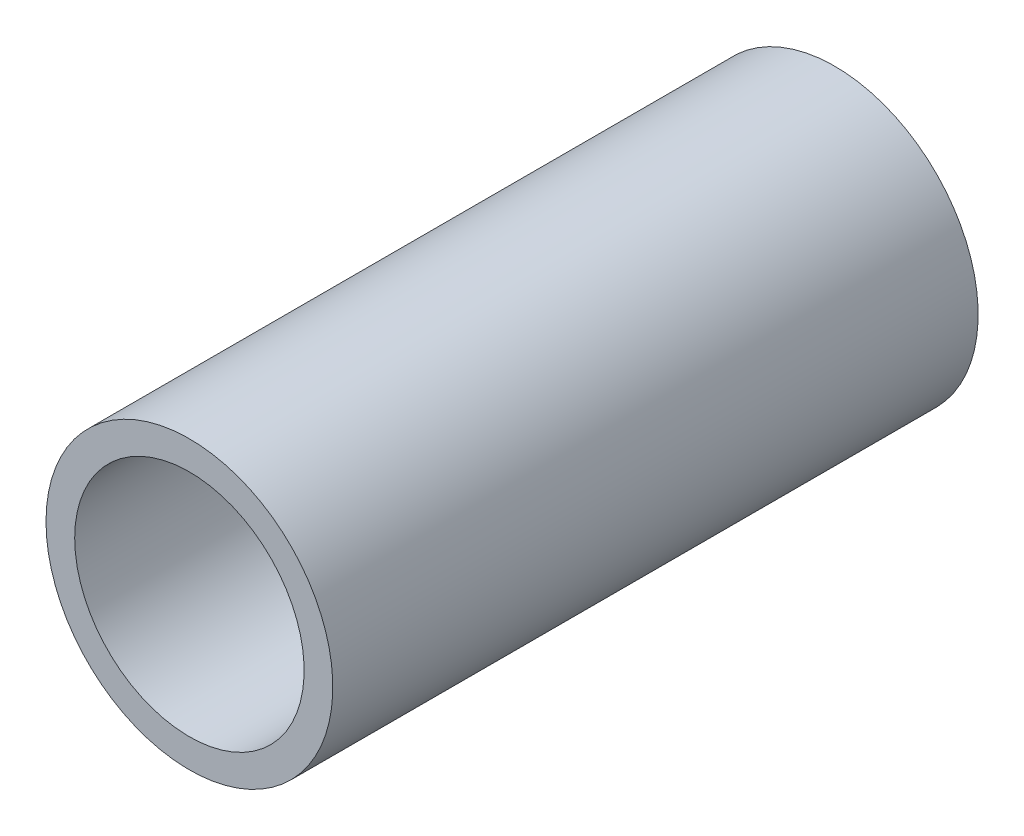
ISO-10303-21;
HEADER;
FILE_DESCRIPTION(('STEP AP214'),'2;1');
FILE_NAME('part.step','',(''),(''),'','','');
FILE_SCHEMA(('AUTOMOTIVE_DESIGN { 1 0 10303 214 1 1 1 1 }'));
ENDSEC;
DATA;
#1=APPLICATION_CONTEXT('core data for automotive mechanical design processes');
#2=APPLICATION_PROTOCOL_DEFINITION('international standard','automotive_design',2000,#1);
#3=PRODUCT_CONTEXT('',#1,'mechanical');
#4=PRODUCT('Part','Part','',(#3));
#5=PRODUCT_RELATED_PRODUCT_CATEGORY('part','',(#4));
#6=PRODUCT_DEFINITION_FORMATION('','',#4);
#7=PRODUCT_DEFINITION_CONTEXT('part definition',#1,'design');
#8=PRODUCT_DEFINITION('design','',#6,#7);
#9=PRODUCT_DEFINITION_SHAPE('','',#8);
#10=(LENGTH_UNIT() NAMED_UNIT(*) SI_UNIT(.MILLI.,.METRE.));
#11=(NAMED_UNIT(*) PLANE_ANGLE_UNIT() SI_UNIT($,.RADIAN.));
#12=(NAMED_UNIT(*) SI_UNIT($,.STERADIAN.) SOLID_ANGLE_UNIT());
#13=UNCERTAINTY_MEASURE_WITH_UNIT(LENGTH_MEASURE(1.E-05),#10,'distance_accuracy_value','');
#14=(GEOMETRIC_REPRESENTATION_CONTEXT(3) GLOBAL_UNCERTAINTY_ASSIGNED_CONTEXT((#13)) GLOBAL_UNIT_ASSIGNED_CONTEXT((#10,
#11,#12)) REPRESENTATION_CONTEXT('',''));
#15=CARTESIAN_POINT('',(0.,0.,0.));
#16=DIRECTION('',(0.,0.,1.));
#17=DIRECTION('',(1.,0.,0.));
#18=AXIS2_PLACEMENT_3D('',#15,#16,#17);
#19=CARTESIAN_POINT('',(0.,0.,45.));
#20=DIRECTION('',(0.,0.,1.));
#21=DIRECTION('',(1.,0.,0.));
#22=AXIS2_PLACEMENT_3D('',#19,#20,#21);
#23=PLANE('',#22);
#24=CARTESIAN_POINT('',(0.,0.,45.));
#25=DIRECTION('',(0.,0.,1.));
#26=DIRECTION('',(1.,0.,0.));
#27=AXIS2_PLACEMENT_3D('',#24,#25,#26);
#28=CIRCLE('',#27,10.);
#29=CARTESIAN_POINT('',(-10.,0.,45.));
#30=VERTEX_POINT('',#29);
#31=EDGE_CURVE('E10',#30,#30,#28,.T.);
#32=ORIENTED_EDGE('',*,*,#31,.T.);
#33=EDGE_LOOP('',(#32));
#34=FACE_BOUND('',#33,.T.);
#35=CARTESIAN_POINT('',(0.,0.,45.));
#36=DIRECTION('',(0.,0.,1.));
#37=DIRECTION('',(1.,0.,0.));
#38=AXIS2_PLACEMENT_3D('',#35,#36,#37);
#39=CIRCLE('',#38,8.);
#40=CARTESIAN_POINT('',(-8.,0.,45.));
#41=VERTEX_POINT('',#40);
#42=EDGE_CURVE('E41',#41,#41,#39,.T.);
#43=ORIENTED_EDGE('',*,*,#42,.F.);
#44=EDGE_LOOP('',(#43));
#45=FACE_BOUND('',#44,.T.);
#46=ADVANCED_FACE('F30',(#34,#45),#23,.T.);
#47=CARTESIAN_POINT('',(0.,0.,0.));
#48=DIRECTION('',(0.,0.,1.));
#49=DIRECTION('',(1.,0.,0.));
#50=AXIS2_PLACEMENT_3D('',#47,#48,#49);
#51=PLANE('',#50);
#52=CARTESIAN_POINT('',(0.,0.,0.));
#53=DIRECTION('',(0.,0.,1.));
#54=DIRECTION('',(1.,0.,0.));
#55=AXIS2_PLACEMENT_3D('',#52,#53,#54);
#56=CIRCLE('',#55,10.);
#57=CARTESIAN_POINT('',(-10.,0.,0.));
#58=VERTEX_POINT('',#57);
#59=EDGE_CURVE('E34',#58,#58,#56,.T.);
#60=ORIENTED_EDGE('',*,*,#59,.F.);
#61=EDGE_LOOP('',(#60));
#62=FACE_BOUND('',#61,.T.);
#63=CARTESIAN_POINT('',(0.,0.,0.));
#64=DIRECTION('',(0.,0.,1.));
#65=DIRECTION('',(1.,0.,0.));
#66=AXIS2_PLACEMENT_3D('',#63,#64,#65);
#67=CIRCLE('',#66,8.);
#68=CARTESIAN_POINT('',(-8.,0.,0.));
#69=VERTEX_POINT('',#68);
#70=EDGE_CURVE('E43',#69,#69,#67,.T.);
#71=ORIENTED_EDGE('',*,*,#70,.T.);
#72=EDGE_LOOP('',(#71));
#73=FACE_BOUND('',#72,.T.);
#74=ADVANCED_FACE('F53',(#62,#73),#51,.F.);
#75=CARTESIAN_POINT('',(0.,0.,45.));
#76=DIRECTION('',(0.,0.,-1.));
#77=DIRECTION('',(-1.,0.,0.));
#78=AXIS2_PLACEMENT_3D('',#75,#76,#77);
#79=CYLINDRICAL_SURFACE('',#78,10.);
#80=CARTESIAN_POINT('',(-10.,0.,45.));
#81=CARTESIAN_POINT('',(-10.,0.,44.53125));
#82=CARTESIAN_POINT('',(-10.,0.,44.0625));
#83=CARTESIAN_POINT('',(-10.,0.,43.125));
#84=CARTESIAN_POINT('',(-10.,0.,42.65625));
#85=CARTESIAN_POINT('',(-10.,0.,41.71875));
#86=CARTESIAN_POINT('',(-10.,0.,41.25));
#87=CARTESIAN_POINT('',(-10.,0.,40.3125));
#88=CARTESIAN_POINT('',(-10.,0.,39.84375));
#89=CARTESIAN_POINT('',(-10.,0.,38.90625));
#90=CARTESIAN_POINT('',(-10.,0.,38.4375));
#91=CARTESIAN_POINT('',(-10.,0.,37.5));
#92=CARTESIAN_POINT('',(-10.,0.,37.03125));
#93=CARTESIAN_POINT('',(-10.,0.,36.09375));
#94=CARTESIAN_POINT('',(-10.,0.,35.625));
#95=CARTESIAN_POINT('',(-10.,0.,34.6875));
#96=CARTESIAN_POINT('',(-10.,0.,34.21875));
#97=CARTESIAN_POINT('',(-10.,0.,33.28125));
#98=CARTESIAN_POINT('',(-10.,0.,32.8125));
#99=CARTESIAN_POINT('',(-10.,0.,31.875));
#100=CARTESIAN_POINT('',(-10.,0.,31.40625));
#101=CARTESIAN_POINT('',(-10.,0.,30.46875));
#102=CARTESIAN_POINT('',(-10.,0.,30.));
#103=CARTESIAN_POINT('',(-10.,0.,29.0625));
#104=CARTESIAN_POINT('',(-10.,0.,28.59375));
#105=CARTESIAN_POINT('',(-10.,0.,27.65625));
#106=CARTESIAN_POINT('',(-10.,0.,27.1875));
#107=CARTESIAN_POINT('',(-10.,0.,26.25));
#108=CARTESIAN_POINT('',(-10.,0.,25.78125));
#109=CARTESIAN_POINT('',(-10.,0.,24.84375));
#110=CARTESIAN_POINT('',(-10.,0.,24.375));
#111=CARTESIAN_POINT('',(-10.,0.,23.4375));
#112=CARTESIAN_POINT('',(-10.,0.,22.96875));
#113=CARTESIAN_POINT('',(-10.,0.,22.03125));
#114=CARTESIAN_POINT('',(-10.,0.,21.5625));
#115=CARTESIAN_POINT('',(-10.,0.,20.625));
#116=CARTESIAN_POINT('',(-10.,0.,20.15625));
#117=CARTESIAN_POINT('',(-10.,0.,19.21875));
#118=CARTESIAN_POINT('',(-10.,0.,18.75));
#119=CARTESIAN_POINT('',(-10.,0.,17.8125));
#120=CARTESIAN_POINT('',(-10.,0.,17.34375));
#121=CARTESIAN_POINT('',(-10.,0.,16.40625));
#122=CARTESIAN_POINT('',(-10.,0.,15.9375));
#123=CARTESIAN_POINT('',(-10.,0.,15.));
#124=CARTESIAN_POINT('',(-10.,0.,14.53125));
#125=CARTESIAN_POINT('',(-10.,0.,13.59375));
#126=CARTESIAN_POINT('',(-10.,0.,13.125));
#127=CARTESIAN_POINT('',(-10.,0.,12.1875));
#128=CARTESIAN_POINT('',(-10.,0.,11.71875));
#129=CARTESIAN_POINT('',(-10.,0.,10.78125));
#130=CARTESIAN_POINT('',(-10.,0.,10.3125));
#131=CARTESIAN_POINT('',(-10.,0.,9.375));
#132=CARTESIAN_POINT('',(-10.,0.,8.90625));
#133=CARTESIAN_POINT('',(-10.,0.,7.96874999999999));
#134=CARTESIAN_POINT('',(-10.,0.,7.5));
#135=CARTESIAN_POINT('',(-10.,0.,6.5625));
#136=CARTESIAN_POINT('',(-10.,0.,6.09375));
#137=CARTESIAN_POINT('',(-10.,0.,5.15625));
#138=CARTESIAN_POINT('',(-10.,0.,4.68749999999999));
#139=CARTESIAN_POINT('',(-10.,0.,3.74999999999999));
#140=CARTESIAN_POINT('',(-10.,0.,3.28124999999999));
#141=CARTESIAN_POINT('',(-10.,0.,2.34374999999999));
#142=CARTESIAN_POINT('',(-10.,0.,1.87499999999999));
#143=CARTESIAN_POINT('',(-10.,0.,0.937499999999992));
#144=CARTESIAN_POINT('',(-10.,0.,0.468749999999993));
#145=CARTESIAN_POINT('',(-10.,0.,0.));
#146=B_SPLINE_CURVE_WITH_KNOTS('',3,(#80,#81,#82,#83,#84,#85,#86,#87,#88,#89,#90,#91,#92,#93,
#94,#95,#96,#97,#98,#99,#100,#101,#102,#103,#104,#105,#106,#107,#108,#109,#110,#111,#112,#113,
#114,#115,#116,#117,#118,#119,#120,#121,#122,#123,#124,#125,#126,#127,#128,#129,#130,#131,#132,
#133,#134,#135,#136,#137,#138,#139,#140,#141,#142,#143,#144,#145),.UNSPECIFIED.,.F.,.F.,(4,2,2,
2,2,2,2,2,2,2,2,2,2,2,2,2,2,2,2,2,2,2,2,2,2,2,2,2,2,2,2,2,4),(0.,1.40625,2.8125,
4.21875000000001,5.62500000000001,7.03125,8.4375,9.84375000000001,11.25,12.65625,14.0625,
15.46875,16.875,18.28125,19.6875,21.09375,22.5,23.90625,25.3125,26.71875,28.125,29.53125,
30.9375,32.34375,33.75,35.15625,36.5625,37.96875,39.375,40.78125,42.1875,43.59375,45.),.UNSPECIFIED.);
#147=EDGE_CURVE('BSEAM32',#30,#58,#146,.T.);
#148=ORIENTED_EDGE('',*,*,#31,.F.);
#149=ORIENTED_EDGE('',*,*,#59,.T.);
#150=ORIENTED_EDGE('',*,*,#147,.T.);
#151=ORIENTED_EDGE('',*,*,#147,.F.);
#152=EDGE_LOOP('',(#148,#150,#149,#151));
#153=FACE_BOUND('',#152,.T.);
#154=ADVANCED_FACE('F32',(#153),#79,.T.);
#155=CARTESIAN_POINT('',(0.,0.,45.));
#156=DIRECTION('',(0.,0.,-1.));
#157=DIRECTION('',(-1.,0.,0.));
#158=AXIS2_PLACEMENT_3D('',#155,#156,#157);
#159=CYLINDRICAL_SURFACE('',#158,8.);
#160=CARTESIAN_POINT('',(-8.,0.,45.));
#161=CARTESIAN_POINT('',(-8.,0.,44.53125));
#162=CARTESIAN_POINT('',(-8.,0.,44.0625));
#163=CARTESIAN_POINT('',(-8.,0.,43.125));
#164=CARTESIAN_POINT('',(-8.,0.,42.65625));
#165=CARTESIAN_POINT('',(-8.,0.,41.71875));
#166=CARTESIAN_POINT('',(-8.,0.,41.25));
#167=CARTESIAN_POINT('',(-8.,0.,40.3125));
#168=CARTESIAN_POINT('',(-8.,0.,39.84375));
#169=CARTESIAN_POINT('',(-8.,0.,38.90625));
#170=CARTESIAN_POINT('',(-8.,0.,38.4375));
#171=CARTESIAN_POINT('',(-8.,0.,37.5));
#172=CARTESIAN_POINT('',(-8.,0.,37.03125));
#173=CARTESIAN_POINT('',(-8.,0.,36.09375));
#174=CARTESIAN_POINT('',(-8.,0.,35.625));
#175=CARTESIAN_POINT('',(-8.,0.,34.6875));
#176=CARTESIAN_POINT('',(-8.,0.,34.21875));
#177=CARTESIAN_POINT('',(-8.,0.,33.28125));
#178=CARTESIAN_POINT('',(-8.,0.,32.8125));
#179=CARTESIAN_POINT('',(-8.,0.,31.875));
#180=CARTESIAN_POINT('',(-8.,0.,31.40625));
#181=CARTESIAN_POINT('',(-8.,0.,30.46875));
#182=CARTESIAN_POINT('',(-8.,0.,30.));
#183=CARTESIAN_POINT('',(-8.,0.,29.0625));
#184=CARTESIAN_POINT('',(-8.,0.,28.59375));
#185=CARTESIAN_POINT('',(-8.,0.,27.65625));
#186=CARTESIAN_POINT('',(-8.,0.,27.1875));
#187=CARTESIAN_POINT('',(-8.,0.,26.25));
#188=CARTESIAN_POINT('',(-8.,0.,25.78125));
#189=CARTESIAN_POINT('',(-8.,0.,24.84375));
#190=CARTESIAN_POINT('',(-8.,0.,24.375));
#191=CARTESIAN_POINT('',(-8.,0.,23.4375));
#192=CARTESIAN_POINT('',(-8.,0.,22.96875));
#193=CARTESIAN_POINT('',(-8.,0.,22.03125));
#194=CARTESIAN_POINT('',(-8.,0.,21.5625));
#195=CARTESIAN_POINT('',(-8.,0.,20.625));
#196=CARTESIAN_POINT('',(-8.,0.,20.15625));
#197=CARTESIAN_POINT('',(-8.,0.,19.21875));
#198=CARTESIAN_POINT('',(-8.,0.,18.75));
#199=CARTESIAN_POINT('',(-8.,0.,17.8125));
#200=CARTESIAN_POINT('',(-8.,0.,17.34375));
#201=CARTESIAN_POINT('',(-8.,0.,16.40625));
#202=CARTESIAN_POINT('',(-8.,0.,15.9375));
#203=CARTESIAN_POINT('',(-8.,0.,15.));
#204=CARTESIAN_POINT('',(-8.,0.,14.53125));
#205=CARTESIAN_POINT('',(-8.,0.,13.59375));
#206=CARTESIAN_POINT('',(-8.,0.,13.125));
#207=CARTESIAN_POINT('',(-8.,0.,12.1875));
#208=CARTESIAN_POINT('',(-8.,0.,11.71875));
#209=CARTESIAN_POINT('',(-8.,0.,10.78125));
#210=CARTESIAN_POINT('',(-8.,0.,10.3125));
#211=CARTESIAN_POINT('',(-8.,0.,9.375));
#212=CARTESIAN_POINT('',(-8.,0.,8.90625));
#213=CARTESIAN_POINT('',(-8.,0.,7.96874999999999));
#214=CARTESIAN_POINT('',(-8.,0.,7.5));
#215=CARTESIAN_POINT('',(-8.,0.,6.5625));
#216=CARTESIAN_POINT('',(-8.,0.,6.09375));
#217=CARTESIAN_POINT('',(-8.,0.,5.15625));
#218=CARTESIAN_POINT('',(-8.,0.,4.68749999999999));
#219=CARTESIAN_POINT('',(-8.,0.,3.74999999999999));
#220=CARTESIAN_POINT('',(-8.,0.,3.28124999999999));
#221=CARTESIAN_POINT('',(-8.,0.,2.34374999999999));
#222=CARTESIAN_POINT('',(-8.,0.,1.87499999999999));
#223=CARTESIAN_POINT('',(-8.,0.,0.937499999999992));
#224=CARTESIAN_POINT('',(-8.,0.,0.468749999999993));
#225=CARTESIAN_POINT('',(-8.,0.,0.));
#226=B_SPLINE_CURVE_WITH_KNOTS('',3,(#160,#161,#162,#163,#164,#165,#166,#167,#168,#169,#170,
#171,#172,#173,#174,#175,#176,#177,#178,#179,#180,#181,#182,#183,#184,#185,#186,#187,#188,#189,
#190,#191,#192,#193,#194,#195,#196,#197,#198,#199,#200,#201,#202,#203,#204,#205,#206,#207,#208,
#209,#210,#211,#212,#213,#214,#215,#216,#217,#218,#219,#220,#221,#222,#223,#224,#225),
.UNSPECIFIED.,.F.,.F.,(4,2,2,2,2,2,2,2,2,2,2,2,2,2,2,2,2,2,2,2,2,2,2,2,2,2,2,2,2,2,2,2,4),(0.,
1.40625,2.8125,4.21875000000001,5.62500000000001,7.03125,8.4375,9.84375000000001,11.25,12.65625,
14.0625,15.46875,16.875,18.28125,19.6875,21.09375,22.5,23.90625,25.3125,26.71875,28.125,
29.53125,30.9375,32.34375,33.75,35.15625,36.5625,37.96875,39.375,40.78125,42.1875,43.59375,45.),.UNSPECIFIED.);
#227=EDGE_CURVE('BSEAM49',#41,#69,#226,.T.);
#228=ORIENTED_EDGE('',*,*,#42,.T.);
#229=ORIENTED_EDGE('',*,*,#70,.F.);
#230=ORIENTED_EDGE('',*,*,#227,.T.);
#231=ORIENTED_EDGE('',*,*,#227,.F.);
#232=EDGE_LOOP('',(#228,#230,#229,#231));
#233=FACE_BOUND('',#232,.T.);
#234=ADVANCED_FACE('F49',(#233),#159,.F.);
#235=CLOSED_SHELL('',(#46,#74,#154,#234));
#236=MANIFOLD_SOLID_BREP('B2',#235);
#237=ADVANCED_BREP_SHAPE_REPRESENTATION('',(#18,#236),#14);
#238=SHAPE_DEFINITION_REPRESENTATION(#9,#237);
ENDSEC;
END-ISO-10303-21;
